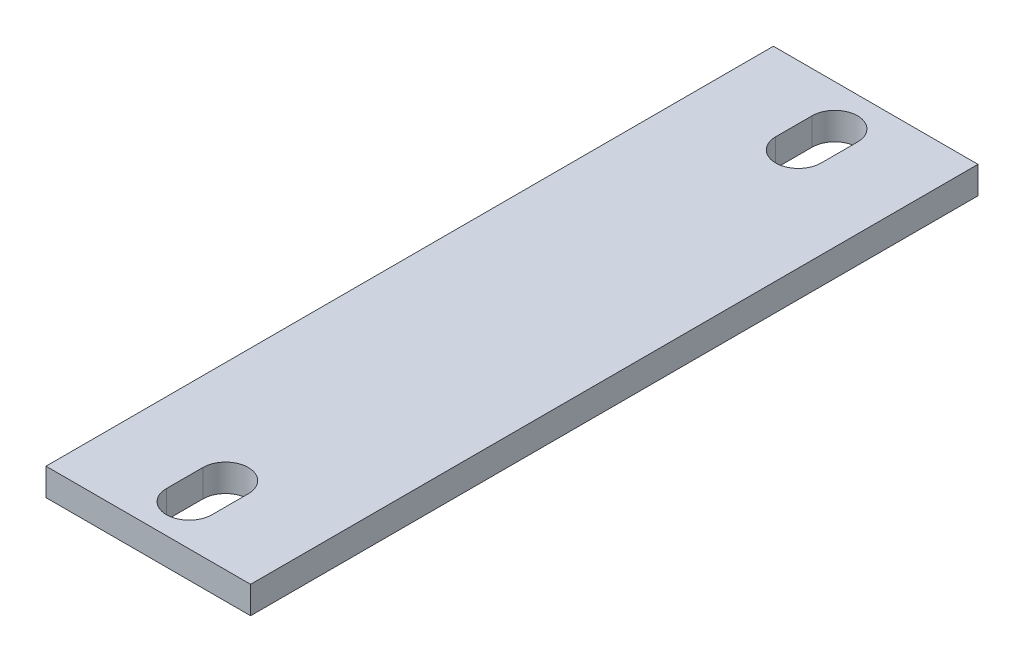
ISO-10303-21;
HEADER;
FILE_DESCRIPTION(('STEP AP214'),'2;1');
FILE_NAME('part.step','',(''),(''),'','','');
FILE_SCHEMA(('AUTOMOTIVE_DESIGN { 1 0 10303 214 1 1 1 1 }'));
ENDSEC;
DATA;
#1=APPLICATION_CONTEXT('core data for automotive mechanical design processes');
#2=APPLICATION_PROTOCOL_DEFINITION('international standard','automotive_design',2000,#1);
#3=PRODUCT_CONTEXT('',#1,'mechanical');
#4=PRODUCT('Part','Part','',(#3));
#5=PRODUCT_RELATED_PRODUCT_CATEGORY('part','',(#4));
#6=PRODUCT_DEFINITION_FORMATION('','',#4);
#7=PRODUCT_DEFINITION_CONTEXT('part definition',#1,'design');
#8=PRODUCT_DEFINITION('design','',#6,#7);
#9=PRODUCT_DEFINITION_SHAPE('','',#8);
#10=(LENGTH_UNIT() NAMED_UNIT(*) SI_UNIT(.MILLI.,.METRE.));
#11=(NAMED_UNIT(*) PLANE_ANGLE_UNIT() SI_UNIT($,.RADIAN.));
#12=(NAMED_UNIT(*) SI_UNIT($,.STERADIAN.) SOLID_ANGLE_UNIT());
#13=UNCERTAINTY_MEASURE_WITH_UNIT(LENGTH_MEASURE(1.E-05),#10,'distance_accuracy_value','');
#14=(GEOMETRIC_REPRESENTATION_CONTEXT(3) GLOBAL_UNCERTAINTY_ASSIGNED_CONTEXT((#13)) GLOBAL_UNIT_ASSIGNED_CONTEXT((#10,
#11,#12)) REPRESENTATION_CONTEXT('',''));
#15=CARTESIAN_POINT('',(0.,0.,0.));
#16=DIRECTION('',(0.,0.,1.));
#17=DIRECTION('',(1.,0.,0.));
#18=AXIS2_PLACEMENT_3D('',#15,#16,#17);
#19=CARTESIAN_POINT('',(0.,3.,0.));
#20=DIRECTION('',(0.,-1.,0.));
#21=DIRECTION('',(0.,0.,-1.));
#22=AXIS2_PLACEMENT_3D('',#19,#20,#21);
#23=PLANE('',#22);
#24=CARTESIAN_POINT('',(0.,3.,-63.));
#25=DIRECTION('',(0.,1.,0.));
#26=DIRECTION('',(0.,0.,1.));
#27=AXIS2_PLACEMENT_3D('',#24,#25,#26);
#28=CIRCLE('',#27,5.00000000000002);
#29=CARTESIAN_POINT('',(-5.,3.,-63.));
#30=VERTEX_POINT('',#29);
#31=CARTESIAN_POINT('',(5.00000000000003,3.,-63.));
#32=VERTEX_POINT('',#31);
#33=EDGE_CURVE('E161',#30,#32,#28,.T.);
#34=ORIENTED_EDGE('',*,*,#33,.F.);
#35=DIRECTION('',(0.,0.,1.));
#36=VECTOR('',#35,1.);
#37=CARTESIAN_POINT('',(-5.,3.,-63.));
#38=LINE('',#37,#36);
#39=CARTESIAN_POINT('',(-5.,3.,-71.));
#40=VERTEX_POINT('',#39);
#41=EDGE_CURVE('E169',#40,#30,#38,.T.);
#42=ORIENTED_EDGE('',*,*,#41,.F.);
#43=CARTESIAN_POINT('',(0.,3.,-71.));
#44=DIRECTION('',(0.,1.,0.));
#45=DIRECTION('',(0.,0.,1.));
#46=AXIS2_PLACEMENT_3D('',#43,#44,#45);
#47=CIRCLE('',#46,5.00000000000002);
#48=CARTESIAN_POINT('',(5.00000000000002,3.,-71.));
#49=VERTEX_POINT('',#48);
#50=EDGE_CURVE('E166',#49,#40,#47,.T.);
#51=ORIENTED_EDGE('',*,*,#50,.F.);
#52=DIRECTION('',(0.,0.,-1.));
#53=VECTOR('',#52,1.);
#54=CARTESIAN_POINT('',(5.00000000000003,3.,-63.));
#55=LINE('',#54,#53);
#56=EDGE_CURVE('E163',#32,#49,#55,.T.);
#57=ORIENTED_EDGE('',*,*,#56,.F.);
#58=EDGE_LOOP('',(#34,#42,#51,#57));
#59=FACE_BOUND('',#58,.T.);
#60=DIRECTION('',(0.,0.,-1.));
#61=VECTOR('',#60,1.);
#62=CARTESIAN_POINT('',(22.5,3.,80.));
#63=LINE('',#62,#61);
#64=CARTESIAN_POINT('',(22.5,3.,80.));
#65=VERTEX_POINT('',#64);
#66=CARTESIAN_POINT('',(22.5,3.,-80.));
#67=VERTEX_POINT('',#66);
#68=EDGE_CURVE('E192',#65,#67,#63,.T.);
#69=ORIENTED_EDGE('',*,*,#68,.T.);
#70=DIRECTION('',(-1.,0.,0.));
#71=VECTOR('',#70,1.);
#72=CARTESIAN_POINT('',(-22.5,3.,-80.));
#73=LINE('',#72,#71);
#74=CARTESIAN_POINT('',(-22.5,3.,-80.));
#75=VERTEX_POINT('',#74);
#76=EDGE_CURVE('E195',#67,#75,#73,.T.);
#77=ORIENTED_EDGE('',*,*,#76,.T.);
#78=DIRECTION('',(0.,0.,1.));
#79=VECTOR('',#78,1.);
#80=CARTESIAN_POINT('',(-22.5,3.,80.));
#81=LINE('',#80,#79);
#82=CARTESIAN_POINT('',(-22.5,3.,80.));
#83=VERTEX_POINT('',#82);
#84=EDGE_CURVE('E198',#75,#83,#81,.T.);
#85=ORIENTED_EDGE('',*,*,#84,.T.);
#86=DIRECTION('',(1.,0.,0.));
#87=VECTOR('',#86,1.);
#88=CARTESIAN_POINT('',(-22.5,3.,80.));
#89=LINE('',#88,#87);
#90=EDGE_CURVE('E200',#83,#65,#89,.T.);
#91=ORIENTED_EDGE('',*,*,#90,.T.);
#92=EDGE_LOOP('',(#69,#77,#85,#91));
#93=FACE_BOUND('',#92,.T.);
#94=CARTESIAN_POINT('',(0.,3.,63.));
#95=DIRECTION('',(0.,1.,0.));
#96=DIRECTION('',(0.,0.,-1.));
#97=AXIS2_PLACEMENT_3D('',#94,#95,#96);
#98=CIRCLE('',#97,5.00000000000002);
#99=CARTESIAN_POINT('',(5.00000000000003,3.,63.));
#100=VERTEX_POINT('',#99);
#101=CARTESIAN_POINT('',(-5.,3.,63.));
#102=VERTEX_POINT('',#101);
#103=EDGE_CURVE('E125',#100,#102,#98,.T.);
#104=ORIENTED_EDGE('',*,*,#103,.F.);
#105=DIRECTION('',(0.,0.,-1.));
#106=VECTOR('',#105,1.);
#107=CARTESIAN_POINT('',(5.00000000000003,3.,63.));
#108=LINE('',#107,#106);
#109=CARTESIAN_POINT('',(5.00000000000004,3.,71.));
#110=VERTEX_POINT('',#109);
#111=EDGE_CURVE('E147',#110,#100,#108,.T.);
#112=ORIENTED_EDGE('',*,*,#111,.F.);
#113=CARTESIAN_POINT('',(0.,3.,71.));
#114=DIRECTION('',(0.,1.,0.));
#115=DIRECTION('',(0.,0.,-1.));
#116=AXIS2_PLACEMENT_3D('',#113,#114,#115);
#117=CIRCLE('',#116,5.00000000000002);
#118=CARTESIAN_POINT('',(-5.,3.,71.));
#119=VERTEX_POINT('',#118);
#120=EDGE_CURVE('E145',#119,#110,#117,.T.);
#121=ORIENTED_EDGE('',*,*,#120,.F.);
#122=DIRECTION('',(0.,0.,1.));
#123=VECTOR('',#122,1.);
#124=CARTESIAN_POINT('',(-5.,3.,63.));
#125=LINE('',#124,#123);
#126=EDGE_CURVE('E133',#102,#119,#125,.T.);
#127=ORIENTED_EDGE('',*,*,#126,.F.);
#128=EDGE_LOOP('',(#104,#112,#121,#127));
#129=FACE_BOUND('',#128,.T.);
#130=ADVANCED_FACE('F36',(#59,#93,#129),#23,.F.);
#131=CARTESIAN_POINT('',(0.,-3.,0.));
#132=DIRECTION('',(0.,-1.,0.));
#133=DIRECTION('',(0.,0.,-1.));
#134=AXIS2_PLACEMENT_3D('',#131,#132,#133);
#135=PLANE('',#134);
#136=DIRECTION('',(0.,0.,-1.));
#137=VECTOR('',#136,1.);
#138=CARTESIAN_POINT('',(22.5,-3.,80.));
#139=LINE('',#138,#137);
#140=CARTESIAN_POINT('',(22.5,-3.,80.));
#141=VERTEX_POINT('',#140);
#142=CARTESIAN_POINT('',(22.5,-3.,-80.));
#143=VERTEX_POINT('',#142);
#144=EDGE_CURVE('E191',#141,#143,#139,.T.);
#145=ORIENTED_EDGE('',*,*,#144,.F.);
#146=DIRECTION('',(1.,0.,0.));
#147=VECTOR('',#146,1.);
#148=CARTESIAN_POINT('',(-22.5,-3.,80.));
#149=LINE('',#148,#147);
#150=CARTESIAN_POINT('',(-22.5,-3.,80.));
#151=VERTEX_POINT('',#150);
#152=EDGE_CURVE('E196',#151,#141,#149,.T.);
#153=ORIENTED_EDGE('',*,*,#152,.F.);
#154=DIRECTION('',(0.,0.,1.));
#155=VECTOR('',#154,1.);
#156=CARTESIAN_POINT('',(-22.5,-3.,80.));
#157=LINE('',#156,#155);
#158=CARTESIAN_POINT('',(-22.5,-3.,-80.));
#159=VERTEX_POINT('',#158);
#160=EDGE_CURVE('E207',#159,#151,#157,.T.);
#161=ORIENTED_EDGE('',*,*,#160,.F.);
#162=DIRECTION('',(-1.,0.,0.));
#163=VECTOR('',#162,1.);
#164=CARTESIAN_POINT('',(-22.5,-3.,-80.));
#165=LINE('',#164,#163);
#166=EDGE_CURVE('E205',#143,#159,#165,.T.);
#167=ORIENTED_EDGE('',*,*,#166,.F.);
#168=EDGE_LOOP('',(#145,#153,#161,#167));
#169=FACE_BOUND('',#168,.T.);
#170=DIRECTION('',(0.,0.,1.));
#171=VECTOR('',#170,1.);
#172=CARTESIAN_POINT('',(-5.,-3.,-63.));
#173=LINE('',#172,#171);
#174=CARTESIAN_POINT('',(-5.,-3.,-71.));
#175=VERTEX_POINT('',#174);
#176=CARTESIAN_POINT('',(-5.,-3.,-63.));
#177=VERTEX_POINT('',#176);
#178=EDGE_CURVE('E164',#175,#177,#173,.T.);
#179=ORIENTED_EDGE('',*,*,#178,.T.);
#180=CARTESIAN_POINT('',(0.,-3.,-63.));
#181=DIRECTION('',(0.,1.,0.));
#182=DIRECTION('',(0.,0.,1.));
#183=AXIS2_PLACEMENT_3D('',#180,#181,#182);
#184=CIRCLE('',#183,5.00000000000002);
#185=CARTESIAN_POINT('',(5.00000000000003,-3.,-63.));
#186=VERTEX_POINT('',#185);
#187=EDGE_CURVE('E141',#177,#186,#184,.T.);
#188=ORIENTED_EDGE('',*,*,#187,.T.);
#189=DIRECTION('',(0.,0.,-1.));
#190=VECTOR('',#189,1.);
#191=CARTESIAN_POINT('',(5.00000000000003,-3.,-63.));
#192=LINE('',#191,#190);
#193=CARTESIAN_POINT('',(5.00000000000002,-3.,-71.));
#194=VERTEX_POINT('',#193);
#195=EDGE_CURVE('E174',#186,#194,#192,.T.);
#196=ORIENTED_EDGE('',*,*,#195,.T.);
#197=CARTESIAN_POINT('',(0.,-3.,-71.));
#198=DIRECTION('',(0.,1.,0.));
#199=DIRECTION('',(0.,0.,1.));
#200=AXIS2_PLACEMENT_3D('',#197,#198,#199);
#201=CIRCLE('',#200,5.00000000000002);
#202=EDGE_CURVE('E177',#194,#175,#201,.T.);
#203=ORIENTED_EDGE('',*,*,#202,.T.);
#204=EDGE_LOOP('',(#179,#188,#196,#203));
#205=FACE_BOUND('',#204,.T.);
#206=DIRECTION('',(0.,0.,-1.));
#207=VECTOR('',#206,1.);
#208=CARTESIAN_POINT('',(5.00000000000003,-3.,63.));
#209=LINE('',#208,#207);
#210=CARTESIAN_POINT('',(5.00000000000002,-3.,71.));
#211=VERTEX_POINT('',#210);
#212=CARTESIAN_POINT('',(5.00000000000003,-3.,63.));
#213=VERTEX_POINT('',#212);
#214=EDGE_CURVE('E134',#211,#213,#209,.T.);
#215=ORIENTED_EDGE('',*,*,#214,.T.);
#216=CARTESIAN_POINT('',(0.,-3.,63.));
#217=DIRECTION('',(0.,1.,0.));
#218=DIRECTION('',(0.,0.,-1.));
#219=AXIS2_PLACEMENT_3D('',#216,#217,#218);
#220=CIRCLE('',#219,5.00000000000002);
#221=CARTESIAN_POINT('',(-5.,-3.,63.));
#222=VERTEX_POINT('',#221);
#223=EDGE_CURVE('E59',#213,#222,#220,.T.);
#224=ORIENTED_EDGE('',*,*,#223,.T.);
#225=DIRECTION('',(0.,0.,1.));
#226=VECTOR('',#225,1.);
#227=CARTESIAN_POINT('',(-5.,-3.,63.));
#228=LINE('',#227,#226);
#229=CARTESIAN_POINT('',(-5.,-3.,71.));
#230=VERTEX_POINT('',#229);
#231=EDGE_CURVE('E140',#222,#230,#228,.T.);
#232=ORIENTED_EDGE('',*,*,#231,.T.);
#233=CARTESIAN_POINT('',(0.,-3.,71.));
#234=DIRECTION('',(0.,1.,0.));
#235=DIRECTION('',(0.,0.,-1.));
#236=AXIS2_PLACEMENT_3D('',#233,#234,#235);
#237=CIRCLE('',#236,5.00000000000002);
#238=EDGE_CURVE('E153',#230,#211,#237,.T.);
#239=ORIENTED_EDGE('',*,*,#238,.T.);
#240=EDGE_LOOP('',(#215,#224,#232,#239));
#241=FACE_BOUND('',#240,.T.);
#242=ADVANCED_FACE('F225',(#169,#205,#241),#135,.T.);
#243=CARTESIAN_POINT('',(22.5,3.,80.));
#244=DIRECTION('',(-1.,0.,0.));
#245=DIRECTION('',(0.,0.,1.));
#246=AXIS2_PLACEMENT_3D('',#243,#244,#245);
#247=PLANE('',#246);
#248=ORIENTED_EDGE('',*,*,#144,.T.);
#249=DIRECTION('',(0.,-1.,0.));
#250=VECTOR('',#249,1.);
#251=CARTESIAN_POINT('',(22.5,3.,-80.));
#252=LINE('',#251,#250);
#253=EDGE_CURVE('E11',#67,#143,#252,.T.);
#254=ORIENTED_EDGE('',*,*,#253,.F.);
#255=ORIENTED_EDGE('',*,*,#68,.F.);
#256=DIRECTION('',(0.,-1.,0.));
#257=VECTOR('',#256,1.);
#258=CARTESIAN_POINT('',(22.5,3.,80.));
#259=LINE('',#258,#257);
#260=EDGE_CURVE('E202',#65,#141,#259,.T.);
#261=ORIENTED_EDGE('',*,*,#260,.T.);
#262=EDGE_LOOP('',(#248,#254,#255,#261));
#263=FACE_BOUND('',#262,.T.);
#264=ADVANCED_FACE('F38',(#263),#247,.F.);
#265=CARTESIAN_POINT('',(-22.5,3.,-80.));
#266=DIRECTION('',(0.,0.,1.));
#267=DIRECTION('',(1.,0.,0.));
#268=AXIS2_PLACEMENT_3D('',#265,#266,#267);
#269=PLANE('',#268);
#270=ORIENTED_EDGE('',*,*,#166,.T.);
#271=DIRECTION('',(0.,-1.,0.));
#272=VECTOR('',#271,1.);
#273=CARTESIAN_POINT('',(-22.5,3.,-80.));
#274=LINE('',#273,#272);
#275=EDGE_CURVE('E44',#75,#159,#274,.T.);
#276=ORIENTED_EDGE('',*,*,#275,.F.);
#277=ORIENTED_EDGE('',*,*,#76,.F.);
#278=ORIENTED_EDGE('',*,*,#253,.T.);
#279=EDGE_LOOP('',(#270,#276,#277,#278));
#280=FACE_BOUND('',#279,.T.);
#281=ADVANCED_FACE('F235',(#280),#269,.F.);
#282=CARTESIAN_POINT('',(-22.5,3.,80.));
#283=DIRECTION('',(1.,0.,0.));
#284=DIRECTION('',(0.,0.,-1.));
#285=AXIS2_PLACEMENT_3D('',#282,#283,#284);
#286=PLANE('',#285);
#287=ORIENTED_EDGE('',*,*,#160,.T.);
#288=DIRECTION('',(0.,-1.,0.));
#289=VECTOR('',#288,1.);
#290=CARTESIAN_POINT('',(-22.5,3.,80.));
#291=LINE('',#290,#289);
#292=EDGE_CURVE('E212',#83,#151,#291,.T.);
#293=ORIENTED_EDGE('',*,*,#292,.F.);
#294=ORIENTED_EDGE('',*,*,#84,.F.);
#295=ORIENTED_EDGE('',*,*,#275,.T.);
#296=EDGE_LOOP('',(#287,#293,#294,#295));
#297=FACE_BOUND('',#296,.T.);
#298=ADVANCED_FACE('F219',(#297),#286,.F.);
#299=CARTESIAN_POINT('',(-22.5,3.,80.));
#300=DIRECTION('',(0.,0.,-1.));
#301=DIRECTION('',(-1.,0.,0.));
#302=AXIS2_PLACEMENT_3D('',#299,#300,#301);
#303=PLANE('',#302);
#304=ORIENTED_EDGE('',*,*,#152,.T.);
#305=ORIENTED_EDGE('',*,*,#260,.F.);
#306=ORIENTED_EDGE('',*,*,#90,.F.);
#307=ORIENTED_EDGE('',*,*,#292,.T.);
#308=EDGE_LOOP('',(#304,#305,#306,#307));
#309=FACE_BOUND('',#308,.T.);
#310=ADVANCED_FACE('F229',(#309),#303,.F.);
#311=CARTESIAN_POINT('',(0.,3.,-63.));
#312=DIRECTION('',(0.,-1.,0.));
#313=DIRECTION('',(0.,0.,-1.));
#314=AXIS2_PLACEMENT_3D('',#311,#312,#313);
#315=CYLINDRICAL_SURFACE('',#314,5.00000000000002);
#316=ORIENTED_EDGE('',*,*,#187,.F.);
#317=DIRECTION('',(0.,-1.,0.));
#318=VECTOR('',#317,1.);
#319=CARTESIAN_POINT('',(-5.,3.,-63.));
#320=LINE('',#319,#318);
#321=EDGE_CURVE('E171',#30,#177,#320,.T.);
#322=ORIENTED_EDGE('',*,*,#321,.F.);
#323=ORIENTED_EDGE('',*,*,#33,.T.);
#324=DIRECTION('',(0.,-1.,0.));
#325=VECTOR('',#324,1.);
#326=CARTESIAN_POINT('',(5.00000000000003,3.,-63.));
#327=LINE('',#326,#325);
#328=EDGE_CURVE('E188',#32,#186,#327,.T.);
#329=ORIENTED_EDGE('',*,*,#328,.T.);
#330=EDGE_LOOP('',(#316,#322,#323,#329));
#331=FACE_BOUND('',#330,.T.);
#332=ADVANCED_FACE('F251',(#331),#315,.F.);
#333=CARTESIAN_POINT('',(5.00000000000003,3.,-63.));
#334=DIRECTION('',(-1.,0.,0.));
#335=DIRECTION('',(0.,0.,1.));
#336=AXIS2_PLACEMENT_3D('',#333,#334,#335);
#337=PLANE('',#336);
#338=ORIENTED_EDGE('',*,*,#195,.F.);
#339=ORIENTED_EDGE('',*,*,#328,.F.);
#340=ORIENTED_EDGE('',*,*,#56,.T.);
#341=DIRECTION('',(0.,-1.,0.));
#342=VECTOR('',#341,1.);
#343=CARTESIAN_POINT('',(5.00000000000002,3.,-71.));
#344=LINE('',#343,#342);
#345=EDGE_CURVE('E186',#49,#194,#344,.T.);
#346=ORIENTED_EDGE('',*,*,#345,.T.);
#347=EDGE_LOOP('',(#338,#339,#340,#346));
#348=FACE_BOUND('',#347,.T.);
#349=ADVANCED_FACE('F258',(#348),#337,.T.);
#350=CARTESIAN_POINT('',(0.,3.,-71.));
#351=DIRECTION('',(0.,-1.,0.));
#352=DIRECTION('',(0.,0.,-1.));
#353=AXIS2_PLACEMENT_3D('',#350,#351,#352);
#354=CYLINDRICAL_SURFACE('',#353,5.00000000000002);
#355=ORIENTED_EDGE('',*,*,#202,.F.);
#356=ORIENTED_EDGE('',*,*,#345,.F.);
#357=ORIENTED_EDGE('',*,*,#50,.T.);
#358=DIRECTION('',(0.,-1.,0.));
#359=VECTOR('',#358,1.);
#360=CARTESIAN_POINT('',(-5.,3.,-71.));
#361=LINE('',#360,#359);
#362=EDGE_CURVE('E184',#40,#175,#361,.T.);
#363=ORIENTED_EDGE('',*,*,#362,.T.);
#364=EDGE_LOOP('',(#355,#356,#357,#363));
#365=FACE_BOUND('',#364,.T.);
#366=ADVANCED_FACE('F263',(#365),#354,.F.);
#367=CARTESIAN_POINT('',(-5.,3.,-63.));
#368=DIRECTION('',(1.,0.,0.));
#369=DIRECTION('',(0.,0.,-1.));
#370=AXIS2_PLACEMENT_3D('',#367,#368,#369);
#371=PLANE('',#370);
#372=ORIENTED_EDGE('',*,*,#178,.F.);
#373=ORIENTED_EDGE('',*,*,#362,.F.);
#374=ORIENTED_EDGE('',*,*,#41,.T.);
#375=ORIENTED_EDGE('',*,*,#321,.T.);
#376=EDGE_LOOP('',(#372,#373,#374,#375));
#377=FACE_BOUND('',#376,.T.);
#378=ADVANCED_FACE('F269',(#377),#371,.T.);
#379=CARTESIAN_POINT('',(0.,3.,63.));
#380=DIRECTION('',(0.,-1.,0.));
#381=DIRECTION('',(0.,0.,-1.));
#382=AXIS2_PLACEMENT_3D('',#379,#380,#381);
#383=CYLINDRICAL_SURFACE('',#382,5.00000000000002);
#384=ORIENTED_EDGE('',*,*,#223,.F.);
#385=DIRECTION('',(0.,-1.,0.));
#386=VECTOR('',#385,1.);
#387=CARTESIAN_POINT('',(5.00000000000003,3.,63.));
#388=LINE('',#387,#386);
#389=EDGE_CURVE('E129',#100,#213,#388,.T.);
#390=ORIENTED_EDGE('',*,*,#389,.F.);
#391=ORIENTED_EDGE('',*,*,#103,.T.);
#392=DIRECTION('',(0.,-1.,0.));
#393=VECTOR('',#392,1.);
#394=CARTESIAN_POINT('',(-5.,3.,63.));
#395=LINE('',#394,#393);
#396=EDGE_CURVE('E128',#102,#222,#395,.T.);
#397=ORIENTED_EDGE('',*,*,#396,.T.);
#398=EDGE_LOOP('',(#384,#390,#391,#397));
#399=FACE_BOUND('',#398,.T.);
#400=ADVANCED_FACE('F127',(#399),#383,.F.);
#401=CARTESIAN_POINT('',(-5.,3.,63.));
#402=DIRECTION('',(1.,0.,0.));
#403=DIRECTION('',(0.,0.,-1.));
#404=AXIS2_PLACEMENT_3D('',#401,#402,#403);
#405=PLANE('',#404);
#406=ORIENTED_EDGE('',*,*,#231,.F.);
#407=ORIENTED_EDGE('',*,*,#396,.F.);
#408=ORIENTED_EDGE('',*,*,#126,.T.);
#409=DIRECTION('',(0.,-1.,0.));
#410=VECTOR('',#409,1.);
#411=CARTESIAN_POINT('',(-5.,3.,71.));
#412=LINE('',#411,#410);
#413=EDGE_CURVE('E142',#119,#230,#412,.T.);
#414=ORIENTED_EDGE('',*,*,#413,.T.);
#415=EDGE_LOOP('',(#406,#407,#408,#414));
#416=FACE_BOUND('',#415,.T.);
#417=ADVANCED_FACE('F137',(#416),#405,.T.);
#418=CARTESIAN_POINT('',(0.,3.,71.));
#419=DIRECTION('',(0.,-1.,0.));
#420=DIRECTION('',(0.,0.,-1.));
#421=AXIS2_PLACEMENT_3D('',#418,#419,#420);
#422=CYLINDRICAL_SURFACE('',#421,5.00000000000002);
#423=ORIENTED_EDGE('',*,*,#238,.F.);
#424=ORIENTED_EDGE('',*,*,#413,.F.);
#425=ORIENTED_EDGE('',*,*,#120,.T.);
#426=DIRECTION('',(0.,-1.,0.));
#427=VECTOR('',#426,1.);
#428=CARTESIAN_POINT('',(5.00000000000002,3.,71.));
#429=LINE('',#428,#427);
#430=EDGE_CURVE('E51',#110,#211,#429,.T.);
#431=ORIENTED_EDGE('',*,*,#430,.T.);
#432=EDGE_LOOP('',(#423,#424,#425,#431));
#433=FACE_BOUND('',#432,.T.);
#434=ADVANCED_FACE('F288',(#433),#422,.F.);
#435=CARTESIAN_POINT('',(5.00000000000003,3.,63.));
#436=DIRECTION('',(-1.,0.,0.));
#437=DIRECTION('',(0.,0.,1.));
#438=AXIS2_PLACEMENT_3D('',#435,#436,#437);
#439=PLANE('',#438);
#440=ORIENTED_EDGE('',*,*,#214,.F.);
#441=ORIENTED_EDGE('',*,*,#430,.F.);
#442=ORIENTED_EDGE('',*,*,#111,.T.);
#443=ORIENTED_EDGE('',*,*,#389,.T.);
#444=EDGE_LOOP('',(#440,#441,#442,#443));
#445=FACE_BOUND('',#444,.T.);
#446=ADVANCED_FACE('F291',(#445),#439,.T.);
#447=CLOSED_SHELL('',(#130,#242,#264,#281,#298,#310,#332,#349,#366,#378,#400,#417,#434,#446));
#448=MANIFOLD_SOLID_BREP('B2',#447);
#449=ADVANCED_BREP_SHAPE_REPRESENTATION('',(#18,#448),#14);
#450=SHAPE_DEFINITION_REPRESENTATION(#9,#449);
ENDSEC;
END-ISO-10303-21;
